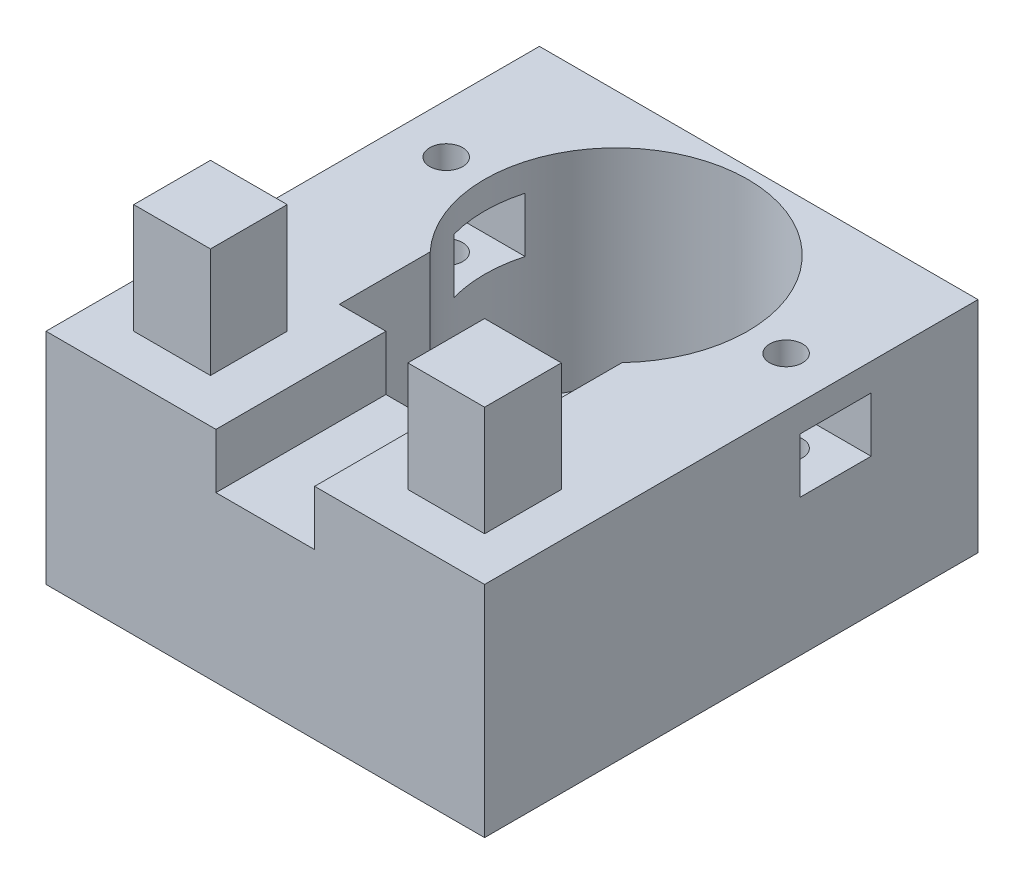
ISO-10303-21;
HEADER;
FILE_DESCRIPTION(('STEP AP214'),'2;1');
FILE_NAME('part.step','',(''),(''),'','','');
FILE_SCHEMA(('AUTOMOTIVE_DESIGN { 1 0 10303 214 1 1 1 1 }'));
ENDSEC;
DATA;
#1=APPLICATION_CONTEXT('core data for automotive mechanical design processes');
#2=APPLICATION_PROTOCOL_DEFINITION('international standard','automotive_design',2000,#1);
#3=PRODUCT_CONTEXT('',#1,'mechanical');
#4=PRODUCT('Part','Part','',(#3));
#5=PRODUCT_RELATED_PRODUCT_CATEGORY('part','',(#4));
#6=PRODUCT_DEFINITION_FORMATION('','',#4);
#7=PRODUCT_DEFINITION_CONTEXT('part definition',#1,'design');
#8=PRODUCT_DEFINITION('design','',#6,#7);
#9=PRODUCT_DEFINITION_SHAPE('','',#8);
#10=(LENGTH_UNIT() NAMED_UNIT(*) SI_UNIT(.MILLI.,.METRE.));
#11=(NAMED_UNIT(*) PLANE_ANGLE_UNIT() SI_UNIT($,.RADIAN.));
#12=(NAMED_UNIT(*) SI_UNIT($,.STERADIAN.) SOLID_ANGLE_UNIT());
#13=UNCERTAINTY_MEASURE_WITH_UNIT(LENGTH_MEASURE(1.E-05),#10,'distance_accuracy_value','');
#14=(GEOMETRIC_REPRESENTATION_CONTEXT(3) GLOBAL_UNCERTAINTY_ASSIGNED_CONTEXT((#13)) GLOBAL_UNIT_ASSIGNED_CONTEXT((#10,
#11,#12)) REPRESENTATION_CONTEXT('',''));
#15=CARTESIAN_POINT('',(0.,0.,0.));
#16=DIRECTION('',(0.,0.,1.));
#17=DIRECTION('',(1.,0.,0.));
#18=AXIS2_PLACEMENT_3D('',#15,#16,#17);
#19=CARTESIAN_POINT('',(0.,20.,0.));
#20=DIRECTION('',(0.,-1.,0.));
#21=DIRECTION('',(0.,0.,-1.));
#22=AXIS2_PLACEMENT_3D('',#19,#20,#21);
#23=PLANE('',#22);
#24=DIRECTION('',(0.,0.,-1.));
#25=VECTOR('',#24,1.);
#26=CARTESIAN_POINT('',(36.,20.,-11.));
#27=LINE('',#26,#25);
#28=CARTESIAN_POINT('',(36.,20.,-4.));
#29=VERTEX_POINT('',#28);
#30=CARTESIAN_POINT('',(36.,20.,-11.));
#31=VERTEX_POINT('',#30);
#32=EDGE_CURVE('E239',#29,#31,#27,.T.);
#33=ORIENTED_EDGE('',*,*,#32,.F.);
#34=DIRECTION('',(1.,0.,0.));
#35=VECTOR('',#34,1.);
#36=CARTESIAN_POINT('',(29.,20.,-4.));
#37=LINE('',#36,#35);
#38=CARTESIAN_POINT('',(29.,20.,-4.));
#39=VERTEX_POINT('',#38);
#40=EDGE_CURVE('E252',#39,#29,#37,.T.);
#41=ORIENTED_EDGE('',*,*,#40,.F.);
#42=DIRECTION('',(0.,0.,1.));
#43=VECTOR('',#42,1.);
#44=CARTESIAN_POINT('',(29.,20.,-11.));
#45=LINE('',#44,#43);
#46=CARTESIAN_POINT('',(29.,20.,-11.));
#47=VERTEX_POINT('',#46);
#48=EDGE_CURVE('E261',#47,#39,#45,.T.);
#49=ORIENTED_EDGE('',*,*,#48,.F.);
#50=DIRECTION('',(-1.,0.,0.));
#51=VECTOR('',#50,1.);
#52=CARTESIAN_POINT('',(29.,20.,-11.));
#53=LINE('',#52,#51);
#54=EDGE_CURVE('E242',#31,#47,#53,.T.);
#55=ORIENTED_EDGE('',*,*,#54,.F.);
#56=EDGE_LOOP('',(#33,#41,#49,#55));
#57=FACE_BOUND('',#56,.T.);
#58=CARTESIAN_POINT('',(35.5,20.,-32.));
#59=DIRECTION('',(0.,1.,0.));
#60=DIRECTION('',(0.,0.,1.));
#61=AXIS2_PLACEMENT_3D('',#58,#59,#60);
#62=CIRCLE('',#61,1.5);
#63=CARTESIAN_POINT('',(35.5,20.,-30.5));
#64=VERTEX_POINT('',#63);
#65=EDGE_CURVE('E353',#64,#64,#62,.T.);
#66=ORIENTED_EDGE('',*,*,#65,.F.);
#67=EDGE_LOOP('',(#66));
#68=FACE_BOUND('',#67,.T.);
#69=CARTESIAN_POINT('',(4.5,20.,-32.));
#70=DIRECTION('',(0.,1.,0.));
#71=DIRECTION('',(0.,0.,1.));
#72=AXIS2_PLACEMENT_3D('',#69,#70,#71);
#73=CIRCLE('',#72,1.5);
#74=CARTESIAN_POINT('',(4.5,20.,-30.5));
#75=VERTEX_POINT('',#74);
#76=EDGE_CURVE('E352',#75,#75,#73,.T.);
#77=ORIENTED_EDGE('',*,*,#76,.F.);
#78=EDGE_LOOP('',(#77));
#79=FACE_BOUND('',#78,.T.);
#80=DIRECTION('',(1.,0.,0.));
#81=VECTOR('',#80,1.);
#82=CARTESIAN_POINT('',(0.,20.,-15.5));
#83=LINE('',#82,#81);
#84=CARTESIAN_POINT('',(24.5,20.,-15.5));
#85=VERTEX_POINT('',#84);
#86=CARTESIAN_POINT('',(28.75,20.,-15.5));
#87=VERTEX_POINT('',#86);
#88=EDGE_CURVE('E382',#85,#87,#83,.T.);
#89=ORIENTED_EDGE('',*,*,#88,.F.);
#90=DIRECTION('',(0.,0.,-1.));
#91=VECTOR('',#90,1.);
#92=CARTESIAN_POINT('',(24.5,20.,3.26150985851279));
#93=LINE('',#92,#91);
#94=CARTESIAN_POINT('',(24.5,20.,0.));
#95=VERTEX_POINT('',#94);
#96=EDGE_CURVE('E277',#95,#85,#93,.T.);
#97=ORIENTED_EDGE('',*,*,#96,.F.);
#98=DIRECTION('',(1.,0.,0.));
#99=VECTOR('',#98,1.);
#100=CARTESIAN_POINT('',(0.,20.,0.));
#101=LINE('',#100,#99);
#102=CARTESIAN_POINT('',(40.,20.,0.));
#103=VERTEX_POINT('',#102);
#104=EDGE_CURVE('E398',#95,#103,#101,.T.);
#105=ORIENTED_EDGE('',*,*,#104,.T.);
#106=DIRECTION('',(0.,0.,-1.));
#107=VECTOR('',#106,1.);
#108=CARTESIAN_POINT('',(40.,20.,0.));
#109=LINE('',#108,#107);
#110=CARTESIAN_POINT('',(40.,20.,-45.));
#111=VERTEX_POINT('',#110);
#112=EDGE_CURVE('E403',#103,#111,#109,.T.);
#113=ORIENTED_EDGE('',*,*,#112,.T.);
#114=DIRECTION('',(-1.,0.,0.));
#115=VECTOR('',#114,1.);
#116=CARTESIAN_POINT('',(0.,20.,-45.));
#117=LINE('',#116,#115);
#118=CARTESIAN_POINT('',(0.,20.,-45.));
#119=VERTEX_POINT('',#118);
#120=EDGE_CURVE('E405',#111,#119,#117,.T.);
#121=ORIENTED_EDGE('',*,*,#120,.T.);
#122=DIRECTION('',(0.,0.,1.));
#123=VECTOR('',#122,1.);
#124=CARTESIAN_POINT('',(0.,20.,0.));
#125=LINE('',#124,#123);
#126=CARTESIAN_POINT('',(0.,20.,0.));
#127=VERTEX_POINT('',#126);
#128=EDGE_CURVE('E395',#119,#127,#125,.T.);
#129=ORIENTED_EDGE('',*,*,#128,.T.);
#130=CARTESIAN_POINT('',(15.5,20.,0.));
#131=VERTEX_POINT('',#130);
#132=EDGE_CURVE('E400',#127,#131,#101,.T.);
#133=ORIENTED_EDGE('',*,*,#132,.T.);
#134=DIRECTION('',(0.,0.,1.));
#135=VECTOR('',#134,1.);
#136=CARTESIAN_POINT('',(15.5,20.,3.26150985851279));
#137=LINE('',#136,#135);
#138=CARTESIAN_POINT('',(15.5,20.,-15.5));
#139=VERTEX_POINT('',#138);
#140=EDGE_CURVE('E281',#139,#131,#137,.T.);
#141=ORIENTED_EDGE('',*,*,#140,.F.);
#142=CARTESIAN_POINT('',(11.25,20.,-15.5));
#143=VERTEX_POINT('',#142);
#144=EDGE_CURVE('E366',#143,#139,#83,.T.);
#145=ORIENTED_EDGE('',*,*,#144,.F.);
#146=DIRECTION('',(0.,0.,-1.));
#147=VECTOR('',#146,1.);
#148=CARTESIAN_POINT('',(11.25,20.,0.));
#149=LINE('',#148,#147);
#150=CARTESIAN_POINT('',(11.25,20.,-23.7879661471716));
#151=VERTEX_POINT('',#150);
#152=EDGE_CURVE('E379',#143,#151,#149,.T.);
#153=ORIENTED_EDGE('',*,*,#152,.T.);
#154=CARTESIAN_POINT('',(20.,20.,-32.));
#155=DIRECTION('',(0.,1.,0.));
#156=DIRECTION('',(0.,0.,1.));
#157=AXIS2_PLACEMENT_3D('',#154,#155,#156);
#158=CIRCLE('',#157,12.);
#159=CARTESIAN_POINT('',(28.75,20.,-23.7879661471716));
#160=VERTEX_POINT('',#159);
#161=EDGE_CURVE('E376',#160,#151,#158,.T.);
#162=ORIENTED_EDGE('',*,*,#161,.F.);
#163=DIRECTION('',(0.,0.,-1.));
#164=VECTOR('',#163,1.);
#165=CARTESIAN_POINT('',(28.75,20.,0.));
#166=LINE('',#165,#164);
#167=EDGE_CURVE('E359',#87,#160,#166,.T.);
#168=ORIENTED_EDGE('',*,*,#167,.F.);
#169=EDGE_LOOP('',(#89,#97,#105,#113,#121,#129,#133,#141,#145,#153,#162,#168));
#170=FACE_BOUND('',#169,.T.);
#171=DIRECTION('',(0.,0.,-1.));
#172=VECTOR('',#171,1.);
#173=CARTESIAN_POINT('',(11.,20.,-4.));
#174=LINE('',#173,#172);
#175=CARTESIAN_POINT('',(11.,20.,-4.));
#176=VERTEX_POINT('',#175);
#177=CARTESIAN_POINT('',(11.,20.,-11.));
#178=VERTEX_POINT('',#177);
#179=EDGE_CURVE('E238',#176,#178,#174,.T.);
#180=ORIENTED_EDGE('',*,*,#179,.F.);
#181=DIRECTION('',(1.,0.,0.));
#182=VECTOR('',#181,1.);
#183=CARTESIAN_POINT('',(4.,20.,-4.));
#184=LINE('',#183,#182);
#185=CARTESIAN_POINT('',(4.,20.,-4.));
#186=VERTEX_POINT('',#185);
#187=EDGE_CURVE('E235',#186,#176,#184,.T.);
#188=ORIENTED_EDGE('',*,*,#187,.F.);
#189=DIRECTION('',(0.,0.,1.));
#190=VECTOR('',#189,1.);
#191=CARTESIAN_POINT('',(4.,20.,-4.));
#192=LINE('',#191,#190);
#193=CARTESIAN_POINT('',(4.,20.,-11.));
#194=VERTEX_POINT('',#193);
#195=EDGE_CURVE('E53',#194,#186,#192,.T.);
#196=ORIENTED_EDGE('',*,*,#195,.F.);
#197=DIRECTION('',(-1.,0.,0.));
#198=VECTOR('',#197,1.);
#199=CARTESIAN_POINT('',(4.,20.,-11.));
#200=LINE('',#199,#198);
#201=EDGE_CURVE('E48',#178,#194,#200,.T.);
#202=ORIENTED_EDGE('',*,*,#201,.F.);
#203=EDGE_LOOP('',(#180,#188,#196,#202));
#204=FACE_BOUND('',#203,.T.);
#205=ADVANCED_FACE('F33',(#57,#68,#79,#170,#204),#23,.F.);
#206=CARTESIAN_POINT('',(4.5,0.,-32.));
#207=DIRECTION('',(0.,1.,0.));
#208=DIRECTION('',(0.,0.,1.));
#209=AXIS2_PLACEMENT_3D('',#206,#207,#208);
#210=CYLINDRICAL_SURFACE('',#209,1.5);
#211=CARTESIAN_POINT('',(4.5,12.5,-32.));
#212=DIRECTION('',(0.,-1.,0.));
#213=DIRECTION('',(0.,0.,-1.));
#214=AXIS2_PLACEMENT_3D('',#211,#212,#213);
#215=CIRCLE('',#214,1.5);
#216=CARTESIAN_POINT('',(4.5,12.5,-33.5));
#217=VERTEX_POINT('',#216);
#218=EDGE_CURVE('E341',#217,#217,#215,.F.);
#219=ORIENTED_EDGE('',*,*,#218,.T.);
#220=EDGE_LOOP('',(#219));
#221=FACE_BOUND('',#220,.T.);
#222=CARTESIAN_POINT('',(4.5,0.,-32.));
#223=DIRECTION('',(0.,1.,0.));
#224=DIRECTION('',(0.,0.,1.));
#225=AXIS2_PLACEMENT_3D('',#222,#223,#224);
#226=CIRCLE('',#225,1.5);
#227=CARTESIAN_POINT('',(4.5,0.,-30.5));
#228=VERTEX_POINT('',#227);
#229=EDGE_CURVE('E356',#228,#228,#226,.T.);
#230=ORIENTED_EDGE('',*,*,#229,.F.);
#231=EDGE_LOOP('',(#230));
#232=FACE_BOUND('',#231,.T.);
#233=ADVANCED_FACE('F493',(#221,#232),#210,.F.);
#234=CARTESIAN_POINT('',(35.5,0.,-32.));
#235=DIRECTION('',(0.,1.,0.));
#236=DIRECTION('',(0.,0.,1.));
#237=AXIS2_PLACEMENT_3D('',#234,#235,#236);
#238=CYLINDRICAL_SURFACE('',#237,1.5);
#239=CARTESIAN_POINT('',(35.5,12.5,-32.));
#240=DIRECTION('',(0.,-1.,0.));
#241=DIRECTION('',(0.,0.,-1.));
#242=AXIS2_PLACEMENT_3D('',#239,#240,#241);
#243=CIRCLE('',#242,1.5);
#244=CARTESIAN_POINT('',(35.5,12.5,-33.5));
#245=VERTEX_POINT('',#244);
#246=EDGE_CURVE('E345',#245,#245,#243,.F.);
#247=ORIENTED_EDGE('',*,*,#246,.T.);
#248=EDGE_LOOP('',(#247));
#249=FACE_BOUND('',#248,.T.);
#250=CARTESIAN_POINT('',(35.5,0.,-32.));
#251=DIRECTION('',(0.,1.,0.));
#252=DIRECTION('',(0.,0.,1.));
#253=AXIS2_PLACEMENT_3D('',#250,#251,#252);
#254=CIRCLE('',#253,1.5);
#255=CARTESIAN_POINT('',(35.5,0.,-30.5));
#256=VERTEX_POINT('',#255);
#257=EDGE_CURVE('E349',#256,#256,#254,.T.);
#258=ORIENTED_EDGE('',*,*,#257,.F.);
#259=EDGE_LOOP('',(#258));
#260=FACE_BOUND('',#259,.T.);
#261=ADVANCED_FACE('F501',(#249,#260),#238,.F.);
#262=CARTESIAN_POINT('',(0.,20.,0.));
#263=DIRECTION('',(1.,0.,0.));
#264=DIRECTION('',(0.,0.,-1.));
#265=AXIS2_PLACEMENT_3D('',#262,#263,#264);
#266=PLANE('',#265);
#267=DIRECTION('',(0.,0.,-1.));
#268=VECTOR('',#267,1.);
#269=CARTESIAN_POINT('',(0.,12.5,-28.75));
#270=LINE('',#269,#268);
#271=CARTESIAN_POINT('',(0.,12.5,-28.75));
#272=VERTEX_POINT('',#271);
#273=CARTESIAN_POINT('',(0.,12.5,-35.25));
#274=VERTEX_POINT('',#273);
#275=EDGE_CURVE('E306',#272,#274,#270,.T.);
#276=ORIENTED_EDGE('',*,*,#275,.T.);
#277=DIRECTION('',(0.,1.,0.));
#278=VECTOR('',#277,1.);
#279=CARTESIAN_POINT('',(0.,17.5,-35.25));
#280=LINE('',#279,#278);
#281=CARTESIAN_POINT('',(0.,17.5,-35.25));
#282=VERTEX_POINT('',#281);
#283=EDGE_CURVE('E296',#274,#282,#280,.T.);
#284=ORIENTED_EDGE('',*,*,#283,.T.);
#285=DIRECTION('',(0.,0.,1.));
#286=VECTOR('',#285,1.);
#287=CARTESIAN_POINT('',(0.,17.5,-28.75));
#288=LINE('',#287,#286);
#289=CARTESIAN_POINT('',(0.,17.5,-28.75));
#290=VERTEX_POINT('',#289);
#291=EDGE_CURVE('E299',#282,#290,#288,.T.);
#292=ORIENTED_EDGE('',*,*,#291,.T.);
#293=DIRECTION('',(0.,-1.,0.));
#294=VECTOR('',#293,1.);
#295=CARTESIAN_POINT('',(0.,17.5,-28.75));
#296=LINE('',#295,#294);
#297=EDGE_CURVE('E303',#290,#272,#296,.T.);
#298=ORIENTED_EDGE('',*,*,#297,.T.);
#299=EDGE_LOOP('',(#276,#284,#292,#298));
#300=FACE_BOUND('',#299,.T.);
#301=DIRECTION('',(0.,0.,1.));
#302=VECTOR('',#301,1.);
#303=CARTESIAN_POINT('',(0.,0.,0.));
#304=LINE('',#303,#302);
#305=CARTESIAN_POINT('',(0.,0.,-45.));
#306=VERTEX_POINT('',#305);
#307=CARTESIAN_POINT('',(0.,0.,0.));
#308=VERTEX_POINT('',#307);
#309=EDGE_CURVE('E388',#306,#308,#304,.T.);
#310=ORIENTED_EDGE('',*,*,#309,.T.);
#311=DIRECTION('',(0.,-1.,0.));
#312=VECTOR('',#311,1.);
#313=CARTESIAN_POINT('',(0.,20.,0.));
#314=LINE('',#313,#312);
#315=EDGE_CURVE('E423',#127,#308,#314,.T.);
#316=ORIENTED_EDGE('',*,*,#315,.F.);
#317=ORIENTED_EDGE('',*,*,#128,.F.);
#318=DIRECTION('',(0.,-1.,0.));
#319=VECTOR('',#318,1.);
#320=CARTESIAN_POINT('',(0.,20.,-45.));
#321=LINE('',#320,#319);
#322=EDGE_CURVE('E407',#119,#306,#321,.T.);
#323=ORIENTED_EDGE('',*,*,#322,.T.);
#324=EDGE_LOOP('',(#310,#316,#317,#323));
#325=FACE_BOUND('',#324,.T.);
#326=ADVANCED_FACE('F35',(#300,#325),#266,.F.);
#327=CARTESIAN_POINT('',(0.,20.,0.));
#328=DIRECTION('',(0.,0.,-1.));
#329=DIRECTION('',(-1.,0.,0.));
#330=AXIS2_PLACEMENT_3D('',#327,#328,#329);
#331=PLANE('',#330);
#332=ORIENTED_EDGE('',*,*,#104,.F.);
#333=DIRECTION('',(0.,-1.,0.));
#334=VECTOR('',#333,1.);
#335=CARTESIAN_POINT('',(24.5,20.,0.));
#336=LINE('',#335,#334);
#337=CARTESIAN_POINT('',(24.5,15.,0.));
#338=VERTEX_POINT('',#337);
#339=EDGE_CURVE('E292',#95,#338,#336,.T.);
#340=ORIENTED_EDGE('',*,*,#339,.T.);
#341=DIRECTION('',(-1.,0.,0.));
#342=VECTOR('',#341,1.);
#343=CARTESIAN_POINT('',(0.,15.,0.));
#344=LINE('',#343,#342);
#345=CARTESIAN_POINT('',(15.5,15.,0.));
#346=VERTEX_POINT('',#345);
#347=EDGE_CURVE('E284',#338,#346,#344,.T.);
#348=ORIENTED_EDGE('',*,*,#347,.T.);
#349=DIRECTION('',(0.,1.,0.));
#350=VECTOR('',#349,1.);
#351=CARTESIAN_POINT('',(15.5,20.,0.));
#352=LINE('',#351,#350);
#353=EDGE_CURVE('E289',#346,#131,#352,.T.);
#354=ORIENTED_EDGE('',*,*,#353,.T.);
#355=ORIENTED_EDGE('',*,*,#132,.F.);
#356=ORIENTED_EDGE('',*,*,#315,.T.);
#357=DIRECTION('',(1.,0.,0.));
#358=VECTOR('',#357,1.);
#359=CARTESIAN_POINT('',(0.,0.,0.));
#360=LINE('',#359,#358);
#361=CARTESIAN_POINT('',(40.,0.,0.));
#362=VERTEX_POINT('',#361);
#363=EDGE_CURVE('E410',#308,#362,#360,.T.);
#364=ORIENTED_EDGE('',*,*,#363,.T.);
#365=DIRECTION('',(0.,-1.,0.));
#366=VECTOR('',#365,1.);
#367=CARTESIAN_POINT('',(40.,20.,0.));
#368=LINE('',#367,#366);
#369=EDGE_CURVE('E420',#103,#362,#368,.T.);
#370=ORIENTED_EDGE('',*,*,#369,.F.);
#371=EDGE_LOOP('',(#332,#340,#348,#354,#355,#356,#364,#370));
#372=FACE_BOUND('',#371,.T.);
#373=ADVANCED_FACE('F458',(#372),#331,.F.);
#374=CARTESIAN_POINT('',(40.,20.,0.));
#375=DIRECTION('',(-1.,0.,0.));
#376=DIRECTION('',(0.,0.,1.));
#377=AXIS2_PLACEMENT_3D('',#374,#375,#376);
#378=PLANE('',#377);
#379=DIRECTION('',(0.,0.,1.));
#380=VECTOR('',#379,1.);
#381=CARTESIAN_POINT('',(40.,17.5,-28.75));
#382=LINE('',#381,#380);
#383=CARTESIAN_POINT('',(40.,17.5,-35.25));
#384=VERTEX_POINT('',#383);
#385=CARTESIAN_POINT('',(40.,17.5,-28.75));
#386=VERTEX_POINT('',#385);
#387=EDGE_CURVE('E311',#384,#386,#382,.T.);
#388=ORIENTED_EDGE('',*,*,#387,.F.);
#389=DIRECTION('',(0.,1.,0.));
#390=VECTOR('',#389,1.);
#391=CARTESIAN_POINT('',(40.,17.5,-35.25));
#392=LINE('',#391,#390);
#393=CARTESIAN_POINT('',(40.,12.5,-35.25));
#394=VERTEX_POINT('',#393);
#395=EDGE_CURVE('E295',#394,#384,#392,.T.);
#396=ORIENTED_EDGE('',*,*,#395,.F.);
#397=DIRECTION('',(0.,0.,-1.));
#398=VECTOR('',#397,1.);
#399=CARTESIAN_POINT('',(40.,12.5,-28.75));
#400=LINE('',#399,#398);
#401=CARTESIAN_POINT('',(40.,12.5,-28.75));
#402=VERTEX_POINT('',#401);
#403=EDGE_CURVE('E300',#402,#394,#400,.T.);
#404=ORIENTED_EDGE('',*,*,#403,.F.);
#405=DIRECTION('',(0.,-1.,0.));
#406=VECTOR('',#405,1.);
#407=CARTESIAN_POINT('',(40.,17.5,-28.75));
#408=LINE('',#407,#406);
#409=EDGE_CURVE('E314',#386,#402,#408,.T.);
#410=ORIENTED_EDGE('',*,*,#409,.F.);
#411=EDGE_LOOP('',(#388,#396,#404,#410));
#412=FACE_BOUND('',#411,.T.);
#413=DIRECTION('',(0.,0.,-1.));
#414=VECTOR('',#413,1.);
#415=CARTESIAN_POINT('',(40.,0.,0.));
#416=LINE('',#415,#414);
#417=CARTESIAN_POINT('',(40.,0.,-45.));
#418=VERTEX_POINT('',#417);
#419=EDGE_CURVE('E412',#362,#418,#416,.T.);
#420=ORIENTED_EDGE('',*,*,#419,.T.);
#421=DIRECTION('',(0.,-1.,0.));
#422=VECTOR('',#421,1.);
#423=CARTESIAN_POINT('',(40.,20.,-45.));
#424=LINE('',#423,#422);
#425=EDGE_CURVE('E417',#111,#418,#424,.T.);
#426=ORIENTED_EDGE('',*,*,#425,.F.);
#427=ORIENTED_EDGE('',*,*,#112,.F.);
#428=ORIENTED_EDGE('',*,*,#369,.T.);
#429=EDGE_LOOP('',(#420,#426,#427,#428));
#430=FACE_BOUND('',#429,.T.);
#431=ADVANCED_FACE('F515',(#412,#430),#378,.F.);
#432=CARTESIAN_POINT('',(0.,20.,-45.));
#433=DIRECTION('',(0.,0.,1.));
#434=DIRECTION('',(1.,0.,0.));
#435=AXIS2_PLACEMENT_3D('',#432,#433,#434);
#436=PLANE('',#435);
#437=DIRECTION('',(-1.,0.,0.));
#438=VECTOR('',#437,1.);
#439=CARTESIAN_POINT('',(0.,0.,-45.));
#440=LINE('',#439,#438);
#441=EDGE_CURVE('E399',#418,#306,#440,.T.);
#442=ORIENTED_EDGE('',*,*,#441,.T.);
#443=ORIENTED_EDGE('',*,*,#322,.F.);
#444=ORIENTED_EDGE('',*,*,#120,.F.);
#445=ORIENTED_EDGE('',*,*,#425,.T.);
#446=EDGE_LOOP('',(#442,#443,#444,#445));
#447=FACE_BOUND('',#446,.T.);
#448=ADVANCED_FACE('F511',(#447),#436,.F.);
#449=CARTESIAN_POINT('',(0.,0.,0.));
#450=DIRECTION('',(0.,-1.,0.));
#451=DIRECTION('',(0.,0.,-1.));
#452=AXIS2_PLACEMENT_3D('',#449,#450,#451);
#453=PLANE('',#452);
#454=ORIENTED_EDGE('',*,*,#257,.T.);
#455=EDGE_LOOP('',(#454));
#456=FACE_BOUND('',#455,.T.);
#457=ORIENTED_EDGE('',*,*,#229,.T.);
#458=EDGE_LOOP('',(#457));
#459=FACE_BOUND('',#458,.T.);
#460=ORIENTED_EDGE('',*,*,#309,.F.);
#461=ORIENTED_EDGE('',*,*,#441,.F.);
#462=ORIENTED_EDGE('',*,*,#419,.F.);
#463=ORIENTED_EDGE('',*,*,#363,.F.);
#464=EDGE_LOOP('',(#460,#461,#462,#463));
#465=FACE_BOUND('',#464,.T.);
#466=ADVANCED_FACE('F508',(#456,#459,#465),#453,.T.);
#467=CARTESIAN_POINT('',(28.75,1.,0.));
#468=DIRECTION('',(1.,0.,0.));
#469=DIRECTION('',(0.,0.,-1.));
#470=AXIS2_PLACEMENT_3D('',#467,#468,#469);
#471=PLANE('',#470);
#472=ORIENTED_EDGE('',*,*,#167,.T.);
#473=DIRECTION('',(0.,1.,0.));
#474=VECTOR('',#473,1.);
#475=CARTESIAN_POINT('',(28.75,1.,-23.7879661471716));
#476=LINE('',#475,#474);
#477=CARTESIAN_POINT('',(28.75,1.,-23.7879661471716));
#478=VERTEX_POINT('',#477);
#479=EDGE_CURVE('E374',#478,#160,#476,.T.);
#480=ORIENTED_EDGE('',*,*,#479,.F.);
#481=DIRECTION('',(0.,0.,-1.));
#482=VECTOR('',#481,1.);
#483=CARTESIAN_POINT('',(28.75,1.,0.));
#484=LINE('',#483,#482);
#485=CARTESIAN_POINT('',(28.75,1.,-15.5));
#486=VERTEX_POINT('',#485);
#487=EDGE_CURVE('E362',#486,#478,#484,.T.);
#488=ORIENTED_EDGE('',*,*,#487,.F.);
#489=DIRECTION('',(0.,1.,0.));
#490=VECTOR('',#489,1.);
#491=CARTESIAN_POINT('',(28.75,1.,-15.5));
#492=LINE('',#491,#490);
#493=EDGE_CURVE('E385',#486,#87,#492,.T.);
#494=ORIENTED_EDGE('',*,*,#493,.T.);
#495=EDGE_LOOP('',(#472,#480,#488,#494));
#496=FACE_BOUND('',#495,.T.);
#497=ADVANCED_FACE('F469',(#496),#471,.F.);
#498=CARTESIAN_POINT('',(0.,1.,-15.5));
#499=DIRECTION('',(0.,0.,1.));
#500=DIRECTION('',(1.,0.,0.));
#501=AXIS2_PLACEMENT_3D('',#498,#499,#500);
#502=PLANE('',#501);
#503=DIRECTION('',(1.,0.,0.));
#504=VECTOR('',#503,1.);
#505=CARTESIAN_POINT('',(0.,15.,-15.5));
#506=LINE('',#505,#504);
#507=CARTESIAN_POINT('',(15.5,15.,-15.5));
#508=VERTEX_POINT('',#507);
#509=CARTESIAN_POINT('',(24.5,15.,-15.5));
#510=VERTEX_POINT('',#509);
#511=EDGE_CURVE('E442',#508,#510,#506,.T.);
#512=ORIENTED_EDGE('',*,*,#511,.T.);
#513=DIRECTION('',(0.,1.,0.));
#514=VECTOR('',#513,1.);
#515=CARTESIAN_POINT('',(24.5,1.,-15.5));
#516=LINE('',#515,#514);
#517=EDGE_CURVE('E11',#510,#85,#516,.T.);
#518=ORIENTED_EDGE('',*,*,#517,.T.);
#519=ORIENTED_EDGE('',*,*,#88,.T.);
#520=ORIENTED_EDGE('',*,*,#493,.F.);
#521=DIRECTION('',(1.,0.,0.));
#522=VECTOR('',#521,1.);
#523=CARTESIAN_POINT('',(0.,1.,-15.5));
#524=LINE('',#523,#522);
#525=CARTESIAN_POINT('',(11.25,1.,-15.5));
#526=VERTEX_POINT('',#525);
#527=EDGE_CURVE('E371',#526,#486,#524,.T.);
#528=ORIENTED_EDGE('',*,*,#527,.F.);
#529=DIRECTION('',(0.,1.,0.));
#530=VECTOR('',#529,1.);
#531=CARTESIAN_POINT('',(11.25,1.,-15.5));
#532=LINE('',#531,#530);
#533=EDGE_CURVE('E389',#526,#143,#532,.T.);
#534=ORIENTED_EDGE('',*,*,#533,.T.);
#535=ORIENTED_EDGE('',*,*,#144,.T.);
#536=DIRECTION('',(0.,-1.,0.));
#537=VECTOR('',#536,1.);
#538=CARTESIAN_POINT('',(15.5,1.,-15.5));
#539=LINE('',#538,#537);
#540=EDGE_CURVE('E41',#139,#508,#539,.T.);
#541=ORIENTED_EDGE('',*,*,#540,.T.);
#542=EDGE_LOOP('',(#512,#518,#519,#520,#528,#534,#535,#541));
#543=FACE_BOUND('',#542,.T.);
#544=ADVANCED_FACE('F446',(#543),#502,.F.);
#545=CARTESIAN_POINT('',(11.25,1.,0.));
#546=DIRECTION('',(1.,0.,0.));
#547=DIRECTION('',(0.,0.,-1.));
#548=AXIS2_PLACEMENT_3D('',#545,#546,#547);
#549=PLANE('',#548);
#550=ORIENTED_EDGE('',*,*,#152,.F.);
#551=ORIENTED_EDGE('',*,*,#533,.F.);
#552=DIRECTION('',(0.,0.,-1.));
#553=VECTOR('',#552,1.);
#554=CARTESIAN_POINT('',(11.25,1.,0.));
#555=LINE('',#554,#553);
#556=CARTESIAN_POINT('',(11.25,1.,-23.7879661471716));
#557=VERTEX_POINT('',#556);
#558=EDGE_CURVE('E369',#526,#557,#555,.T.);
#559=ORIENTED_EDGE('',*,*,#558,.T.);
#560=DIRECTION('',(0.,1.,0.));
#561=VECTOR('',#560,1.);
#562=CARTESIAN_POINT('',(11.25,1.,-23.7879661471716));
#563=LINE('',#562,#561);
#564=EDGE_CURVE('E391',#557,#151,#563,.T.);
#565=ORIENTED_EDGE('',*,*,#564,.T.);
#566=EDGE_LOOP('',(#550,#551,#559,#565));
#567=FACE_BOUND('',#566,.T.);
#568=ADVANCED_FACE('F481',(#567),#549,.T.);
#569=CARTESIAN_POINT('',(20.,1.,-32.));
#570=DIRECTION('',(0.,1.,0.));
#571=DIRECTION('',(0.,0.,1.));
#572=AXIS2_PLACEMENT_3D('',#569,#570,#571);
#573=CYLINDRICAL_SURFACE('',#572,12.);
#574=CARTESIAN_POINT('',(20.,17.5,-32.));
#575=DIRECTION('',(0.,1.,0.));
#576=DIRECTION('',(0.,0.,1.));
#577=AXIS2_PLACEMENT_3D('',#574,#575,#576);
#578=CIRCLE('',#577,12.);
#579=CARTESIAN_POINT('',(8.44848494785207,17.5,-28.75));
#580=VERTEX_POINT('',#579);
#581=CARTESIAN_POINT('',(8.44848494785208,17.5,-35.25));
#582=VERTEX_POINT('',#581);
#583=EDGE_CURVE('E340',#580,#582,#578,.F.);
#584=ORIENTED_EDGE('',*,*,#583,.T.);
#585=DIRECTION('',(0.,1.,0.));
#586=VECTOR('',#585,1.);
#587=CARTESIAN_POINT('',(8.44848494785208,1.,-35.25));
#588=LINE('',#587,#586);
#589=CARTESIAN_POINT('',(8.44848494785208,12.5,-35.25));
#590=VERTEX_POINT('',#589);
#591=EDGE_CURVE('E439',#582,#590,#588,.F.);
#592=ORIENTED_EDGE('',*,*,#591,.T.);
#593=CARTESIAN_POINT('',(20.,12.5,-32.));
#594=DIRECTION('',(0.,-1.,0.));
#595=DIRECTION('',(0.,0.,-1.));
#596=AXIS2_PLACEMENT_3D('',#593,#594,#595);
#597=CIRCLE('',#596,12.);
#598=CARTESIAN_POINT('',(8.44848494785207,12.5,-28.75));
#599=VERTEX_POINT('',#598);
#600=EDGE_CURVE('E348',#590,#599,#597,.F.);
#601=ORIENTED_EDGE('',*,*,#600,.T.);
#602=DIRECTION('',(0.,1.,0.));
#603=VECTOR('',#602,1.);
#604=CARTESIAN_POINT('',(8.44848494785207,1.,-28.75));
#605=LINE('',#604,#603);
#606=EDGE_CURVE('E436',#599,#580,#605,.T.);
#607=ORIENTED_EDGE('',*,*,#606,.T.);
#608=EDGE_LOOP('',(#584,#592,#601,#607));
#609=FACE_BOUND('',#608,.T.);
#610=CARTESIAN_POINT('',(31.5515150521479,12.5,-28.75));
#611=VERTEX_POINT('',#610);
#612=CARTESIAN_POINT('',(31.5515150521479,12.5,-35.25));
#613=VERTEX_POINT('',#612);
#614=EDGE_CURVE('E344',#611,#613,#597,.F.);
#615=ORIENTED_EDGE('',*,*,#614,.T.);
#616=DIRECTION('',(0.,1.,0.));
#617=VECTOR('',#616,1.);
#618=CARTESIAN_POINT('',(31.5515150521479,1.,-35.25));
#619=LINE('',#618,#617);
#620=CARTESIAN_POINT('',(31.5515150521479,17.5,-35.25));
#621=VERTEX_POINT('',#620);
#622=EDGE_CURVE('E433',#613,#621,#619,.T.);
#623=ORIENTED_EDGE('',*,*,#622,.T.);
#624=CARTESIAN_POINT('',(31.5515150521479,17.5,-28.75));
#625=VERTEX_POINT('',#624);
#626=EDGE_CURVE('E337',#621,#625,#578,.F.);
#627=ORIENTED_EDGE('',*,*,#626,.T.);
#628=DIRECTION('',(0.,1.,0.));
#629=VECTOR('',#628,1.);
#630=CARTESIAN_POINT('',(31.5515150521479,1.,-28.75));
#631=LINE('',#630,#629);
#632=EDGE_CURVE('E426',#625,#611,#631,.F.);
#633=ORIENTED_EDGE('',*,*,#632,.T.);
#634=EDGE_LOOP('',(#615,#623,#627,#633));
#635=FACE_BOUND('',#634,.T.);
#636=ORIENTED_EDGE('',*,*,#161,.T.);
#637=ORIENTED_EDGE('',*,*,#564,.F.);
#638=CARTESIAN_POINT('',(20.,1.,-32.));
#639=DIRECTION('',(0.,1.,0.));
#640=DIRECTION('',(0.,0.,1.));
#641=AXIS2_PLACEMENT_3D('',#638,#639,#640);
#642=CIRCLE('',#641,12.);
#643=EDGE_CURVE('E365',#478,#557,#642,.T.);
#644=ORIENTED_EDGE('',*,*,#643,.F.);
#645=ORIENTED_EDGE('',*,*,#479,.T.);
#646=EDGE_LOOP('',(#636,#637,#644,#645));
#647=FACE_BOUND('',#646,.T.);
#648=ADVANCED_FACE('F473',(#609,#635,#647),#573,.F.);
#649=CARTESIAN_POINT('',(0.,1.,0.));
#650=DIRECTION('',(0.,1.,0.));
#651=DIRECTION('',(0.,0.,1.));
#652=AXIS2_PLACEMENT_3D('',#649,#650,#651);
#653=PLANE('',#652);
#654=ORIENTED_EDGE('',*,*,#487,.T.);
#655=ORIENTED_EDGE('',*,*,#643,.T.);
#656=ORIENTED_EDGE('',*,*,#558,.F.);
#657=ORIENTED_EDGE('',*,*,#527,.T.);
#658=EDGE_LOOP('',(#654,#655,#656,#657));
#659=FACE_BOUND('',#658,.T.);
#660=ADVANCED_FACE('F477',(#659),#653,.T.);
#661=CARTESIAN_POINT('',(4.5,17.5,-32.));
#662=DIRECTION('',(0.,1.,0.));
#663=DIRECTION('',(0.,0.,1.));
#664=AXIS2_PLACEMENT_3D('',#661,#662,#663);
#665=CIRCLE('',#664,1.5);
#666=CARTESIAN_POINT('',(4.5,17.5,-30.5));
#667=VERTEX_POINT('',#666);
#668=EDGE_CURVE('E334',#667,#667,#665,.F.);
#669=ORIENTED_EDGE('',*,*,#668,.T.);
#670=EDGE_LOOP('',(#669));
#671=FACE_BOUND('',#670,.T.);
#672=ORIENTED_EDGE('',*,*,#76,.T.);
#673=EDGE_LOOP('',(#672));
#674=FACE_BOUND('',#673,.T.);
#675=ADVANCED_FACE('F504',(#671,#674),#210,.F.);
#676=CARTESIAN_POINT('',(35.5,17.5,-32.));
#677=DIRECTION('',(0.,1.,0.));
#678=DIRECTION('',(0.,0.,1.));
#679=AXIS2_PLACEMENT_3D('',#676,#677,#678);
#680=CIRCLE('',#679,1.5);
#681=CARTESIAN_POINT('',(35.5,17.5,-30.5));
#682=VERTEX_POINT('',#681);
#683=EDGE_CURVE('E322',#682,#682,#680,.F.);
#684=ORIENTED_EDGE('',*,*,#683,.T.);
#685=EDGE_LOOP('',(#684));
#686=FACE_BOUND('',#685,.T.);
#687=ORIENTED_EDGE('',*,*,#65,.T.);
#688=EDGE_LOOP('',(#687));
#689=FACE_BOUND('',#688,.T.);
#690=ADVANCED_FACE('F530',(#686,#689),#238,.F.);
#691=CARTESIAN_POINT('',(0.,12.5,-28.75));
#692=DIRECTION('',(0.,-1.,0.));
#693=DIRECTION('',(0.,0.,-1.));
#694=AXIS2_PLACEMENT_3D('',#691,#692,#693);
#695=PLANE('',#694);
#696=ORIENTED_EDGE('',*,*,#246,.F.);
#697=EDGE_LOOP('',(#696));
#698=FACE_BOUND('',#697,.T.);
#699=DIRECTION('',(1.,0.,0.));
#700=VECTOR('',#699,1.);
#701=CARTESIAN_POINT('',(0.,12.5,-28.75));
#702=LINE('',#701,#700);
#703=EDGE_CURVE('E327',#611,#402,#702,.T.);
#704=ORIENTED_EDGE('',*,*,#703,.T.);
#705=ORIENTED_EDGE('',*,*,#403,.T.);
#706=DIRECTION('',(1.,0.,0.));
#707=VECTOR('',#706,1.);
#708=CARTESIAN_POINT('',(0.,12.5,-35.25));
#709=LINE('',#708,#707);
#710=EDGE_CURVE('E323',#613,#394,#709,.T.);
#711=ORIENTED_EDGE('',*,*,#710,.F.);
#712=ORIENTED_EDGE('',*,*,#614,.F.);
#713=EDGE_LOOP('',(#704,#705,#711,#712));
#714=FACE_BOUND('',#713,.T.);
#715=ADVANCED_FACE('F562',(#698,#714),#695,.F.);
#716=CARTESIAN_POINT('',(0.,17.5,-28.75));
#717=DIRECTION('',(0.,1.,0.));
#718=DIRECTION('',(0.,0.,1.));
#719=AXIS2_PLACEMENT_3D('',#716,#717,#718);
#720=PLANE('',#719);
#721=ORIENTED_EDGE('',*,*,#683,.F.);
#722=EDGE_LOOP('',(#721));
#723=FACE_BOUND('',#722,.T.);
#724=DIRECTION('',(1.,0.,0.));
#725=VECTOR('',#724,1.);
#726=CARTESIAN_POINT('',(0.,17.5,-35.25));
#727=LINE('',#726,#725);
#728=EDGE_CURVE('E309',#621,#384,#727,.T.);
#729=ORIENTED_EDGE('',*,*,#728,.T.);
#730=ORIENTED_EDGE('',*,*,#387,.T.);
#731=DIRECTION('',(1.,0.,0.));
#732=VECTOR('',#731,1.);
#733=CARTESIAN_POINT('',(0.,17.5,-28.75));
#734=LINE('',#733,#732);
#735=EDGE_CURVE('E331',#625,#386,#734,.T.);
#736=ORIENTED_EDGE('',*,*,#735,.F.);
#737=ORIENTED_EDGE('',*,*,#626,.F.);
#738=EDGE_LOOP('',(#729,#730,#736,#737));
#739=FACE_BOUND('',#738,.T.);
#740=ADVANCED_FACE('F574',(#723,#739),#720,.F.);
#741=CARTESIAN_POINT('',(0.,17.5,-28.75));
#742=DIRECTION('',(0.,0.,1.));
#743=DIRECTION('',(1.,0.,0.));
#744=AXIS2_PLACEMENT_3D('',#741,#742,#743);
#745=PLANE('',#744);
#746=ORIENTED_EDGE('',*,*,#735,.T.);
#747=ORIENTED_EDGE('',*,*,#409,.T.);
#748=ORIENTED_EDGE('',*,*,#703,.F.);
#749=ORIENTED_EDGE('',*,*,#632,.F.);
#750=EDGE_LOOP('',(#746,#747,#748,#749));
#751=FACE_BOUND('',#750,.T.);
#752=ADVANCED_FACE('F564',(#751),#745,.F.);
#753=CARTESIAN_POINT('',(0.,17.5,-35.25));
#754=DIRECTION('',(0.,0.,-1.));
#755=DIRECTION('',(-1.,0.,0.));
#756=AXIS2_PLACEMENT_3D('',#753,#754,#755);
#757=PLANE('',#756);
#758=ORIENTED_EDGE('',*,*,#710,.T.);
#759=ORIENTED_EDGE('',*,*,#395,.T.);
#760=ORIENTED_EDGE('',*,*,#728,.F.);
#761=ORIENTED_EDGE('',*,*,#622,.F.);
#762=EDGE_LOOP('',(#758,#759,#760,#761));
#763=FACE_BOUND('',#762,.T.);
#764=ADVANCED_FACE('F572',(#763),#757,.F.);
#765=EDGE_CURVE('E332',#282,#582,#727,.T.);
#766=ORIENTED_EDGE('',*,*,#765,.F.);
#767=ORIENTED_EDGE('',*,*,#283,.F.);
#768=EDGE_CURVE('E319',#274,#590,#709,.T.);
#769=ORIENTED_EDGE('',*,*,#768,.T.);
#770=ORIENTED_EDGE('',*,*,#591,.F.);
#771=EDGE_LOOP('',(#766,#767,#769,#770));
#772=FACE_BOUND('',#771,.T.);
#773=ADVANCED_FACE('F549',(#772),#757,.F.);
#774=EDGE_CURVE('E324',#272,#599,#702,.T.);
#775=ORIENTED_EDGE('',*,*,#774,.F.);
#776=ORIENTED_EDGE('',*,*,#297,.F.);
#777=EDGE_CURVE('E328',#290,#580,#734,.T.);
#778=ORIENTED_EDGE('',*,*,#777,.T.);
#779=ORIENTED_EDGE('',*,*,#606,.F.);
#780=EDGE_LOOP('',(#775,#776,#778,#779));
#781=FACE_BOUND('',#780,.T.);
#782=ADVANCED_FACE('F556',(#781),#745,.F.);
#783=ORIENTED_EDGE('',*,*,#218,.F.);
#784=EDGE_LOOP('',(#783));
#785=FACE_BOUND('',#784,.T.);
#786=ORIENTED_EDGE('',*,*,#768,.F.);
#787=ORIENTED_EDGE('',*,*,#275,.F.);
#788=ORIENTED_EDGE('',*,*,#774,.T.);
#789=ORIENTED_EDGE('',*,*,#600,.F.);
#790=EDGE_LOOP('',(#786,#787,#788,#789));
#791=FACE_BOUND('',#790,.T.);
#792=ADVANCED_FACE('F545',(#785,#791),#695,.F.);
#793=ORIENTED_EDGE('',*,*,#668,.F.);
#794=EDGE_LOOP('',(#793));
#795=FACE_BOUND('',#794,.T.);
#796=ORIENTED_EDGE('',*,*,#777,.F.);
#797=ORIENTED_EDGE('',*,*,#291,.F.);
#798=ORIENTED_EDGE('',*,*,#765,.T.);
#799=ORIENTED_EDGE('',*,*,#583,.F.);
#800=EDGE_LOOP('',(#796,#797,#798,#799));
#801=FACE_BOUND('',#800,.T.);
#802=ADVANCED_FACE('F554',(#795,#801),#720,.F.);
#803=CARTESIAN_POINT('',(24.5,15.,3.26150985851279));
#804=DIRECTION('',(1.,0.,0.));
#805=DIRECTION('',(0.,0.,-1.));
#806=AXIS2_PLACEMENT_3D('',#803,#804,#805);
#807=PLANE('',#806);
#808=ORIENTED_EDGE('',*,*,#96,.T.);
#809=ORIENTED_EDGE('',*,*,#517,.F.);
#810=DIRECTION('',(0.,0.,-1.));
#811=VECTOR('',#810,1.);
#812=CARTESIAN_POINT('',(24.5,15.,3.26150985851279));
#813=LINE('',#812,#811);
#814=EDGE_CURVE('E278',#338,#510,#813,.T.);
#815=ORIENTED_EDGE('',*,*,#814,.F.);
#816=ORIENTED_EDGE('',*,*,#339,.F.);
#817=EDGE_LOOP('',(#808,#809,#815,#816));
#818=FACE_BOUND('',#817,.T.);
#819=ADVANCED_FACE('F464',(#818),#807,.F.);
#820=CARTESIAN_POINT('',(15.5,15.,3.26150985851279));
#821=DIRECTION('',(-1.,0.,0.));
#822=DIRECTION('',(0.,0.,1.));
#823=AXIS2_PLACEMENT_3D('',#820,#821,#822);
#824=PLANE('',#823);
#825=DIRECTION('',(0.,0.,1.));
#826=VECTOR('',#825,1.);
#827=CARTESIAN_POINT('',(15.5,15.,3.26150985851279));
#828=LINE('',#827,#826);
#829=EDGE_CURVE('E280',#508,#346,#828,.T.);
#830=ORIENTED_EDGE('',*,*,#829,.F.);
#831=ORIENTED_EDGE('',*,*,#540,.F.);
#832=ORIENTED_EDGE('',*,*,#140,.T.);
#833=ORIENTED_EDGE('',*,*,#353,.F.);
#834=EDGE_LOOP('',(#830,#831,#832,#833));
#835=FACE_BOUND('',#834,.T.);
#836=ADVANCED_FACE('F451',(#835),#824,.F.);
#837=CARTESIAN_POINT('',(0.,15.,0.));
#838=DIRECTION('',(0.,-1.,0.));
#839=DIRECTION('',(0.,0.,-1.));
#840=AXIS2_PLACEMENT_3D('',#837,#838,#839);
#841=PLANE('',#840);
#842=ORIENTED_EDGE('',*,*,#814,.T.);
#843=ORIENTED_EDGE('',*,*,#511,.F.);
#844=ORIENTED_EDGE('',*,*,#829,.T.);
#845=ORIENTED_EDGE('',*,*,#347,.F.);
#846=EDGE_LOOP('',(#842,#843,#844,#845));
#847=FACE_BOUND('',#846,.T.);
#848=ADVANCED_FACE('F460',(#847),#841,.F.);
#849=CARTESIAN_POINT('',(36.,30.,-11.));
#850=DIRECTION('',(-1.,0.,0.));
#851=DIRECTION('',(0.,0.,1.));
#852=AXIS2_PLACEMENT_3D('',#849,#850,#851);
#853=PLANE('',#852);
#854=ORIENTED_EDGE('',*,*,#32,.T.);
#855=DIRECTION('',(0.,-1.,0.));
#856=VECTOR('',#855,1.);
#857=CARTESIAN_POINT('',(36.,30.,-11.));
#858=LINE('',#857,#856);
#859=CARTESIAN_POINT('',(36.,30.,-11.));
#860=VERTEX_POINT('',#859);
#861=EDGE_CURVE('E274',#860,#31,#858,.T.);
#862=ORIENTED_EDGE('',*,*,#861,.F.);
#863=DIRECTION('',(0.,0.,-1.));
#864=VECTOR('',#863,1.);
#865=CARTESIAN_POINT('',(36.,30.,-11.));
#866=LINE('',#865,#864);
#867=CARTESIAN_POINT('',(36.,30.,-4.));
#868=VERTEX_POINT('',#867);
#869=EDGE_CURVE('E248',#868,#860,#866,.T.);
#870=ORIENTED_EDGE('',*,*,#869,.F.);
#871=DIRECTION('',(0.,-1.,0.));
#872=VECTOR('',#871,1.);
#873=CARTESIAN_POINT('',(36.,30.,-4.));
#874=LINE('',#873,#872);
#875=EDGE_CURVE('E257',#868,#29,#874,.T.);
#876=ORIENTED_EDGE('',*,*,#875,.T.);
#877=EDGE_LOOP('',(#854,#862,#870,#876));
#878=FACE_BOUND('',#877,.T.);
#879=ADVANCED_FACE('F723',(#878),#853,.F.);
#880=CARTESIAN_POINT('',(29.,30.,-11.));
#881=DIRECTION('',(0.,0.,1.));
#882=DIRECTION('',(1.,0.,0.));
#883=AXIS2_PLACEMENT_3D('',#880,#881,#882);
#884=PLANE('',#883);
#885=ORIENTED_EDGE('',*,*,#54,.T.);
#886=DIRECTION('',(0.,-1.,0.));
#887=VECTOR('',#886,1.);
#888=CARTESIAN_POINT('',(29.,30.,-11.));
#889=LINE('',#888,#887);
#890=CARTESIAN_POINT('',(29.,30.,-11.));
#891=VERTEX_POINT('',#890);
#892=EDGE_CURVE('E271',#891,#47,#889,.T.);
#893=ORIENTED_EDGE('',*,*,#892,.F.);
#894=DIRECTION('',(-1.,0.,0.));
#895=VECTOR('',#894,1.);
#896=CARTESIAN_POINT('',(29.,30.,-11.));
#897=LINE('',#896,#895);
#898=EDGE_CURVE('E251',#860,#891,#897,.T.);
#899=ORIENTED_EDGE('',*,*,#898,.F.);
#900=ORIENTED_EDGE('',*,*,#861,.T.);
#901=EDGE_LOOP('',(#885,#893,#899,#900));
#902=FACE_BOUND('',#901,.T.);
#903=ADVANCED_FACE('F732',(#902),#884,.F.);
#904=CARTESIAN_POINT('',(29.,30.,-11.));
#905=DIRECTION('',(1.,0.,0.));
#906=DIRECTION('',(0.,0.,-1.));
#907=AXIS2_PLACEMENT_3D('',#904,#905,#906);
#908=PLANE('',#907);
#909=ORIENTED_EDGE('',*,*,#48,.T.);
#910=DIRECTION('',(0.,-1.,0.));
#911=VECTOR('',#910,1.);
#912=CARTESIAN_POINT('',(29.,30.,-4.));
#913=LINE('',#912,#911);
#914=CARTESIAN_POINT('',(29.,30.,-4.));
#915=VERTEX_POINT('',#914);
#916=EDGE_CURVE('E268',#915,#39,#913,.T.);
#917=ORIENTED_EDGE('',*,*,#916,.F.);
#918=DIRECTION('',(0.,0.,1.));
#919=VECTOR('',#918,1.);
#920=CARTESIAN_POINT('',(29.,30.,-11.));
#921=LINE('',#920,#919);
#922=EDGE_CURVE('E254',#891,#915,#921,.T.);
#923=ORIENTED_EDGE('',*,*,#922,.F.);
#924=ORIENTED_EDGE('',*,*,#892,.T.);
#925=EDGE_LOOP('',(#909,#917,#923,#924));
#926=FACE_BOUND('',#925,.T.);
#927=ADVANCED_FACE('F740',(#926),#908,.F.);
#928=CARTESIAN_POINT('',(29.,30.,-4.));
#929=DIRECTION('',(0.,0.,-1.));
#930=DIRECTION('',(-1.,0.,0.));
#931=AXIS2_PLACEMENT_3D('',#928,#929,#930);
#932=PLANE('',#931);
#933=ORIENTED_EDGE('',*,*,#40,.T.);
#934=ORIENTED_EDGE('',*,*,#875,.F.);
#935=DIRECTION('',(1.,0.,0.));
#936=VECTOR('',#935,1.);
#937=CARTESIAN_POINT('',(29.,30.,-4.));
#938=LINE('',#937,#936);
#939=EDGE_CURVE('E256',#915,#868,#938,.T.);
#940=ORIENTED_EDGE('',*,*,#939,.F.);
#941=ORIENTED_EDGE('',*,*,#916,.T.);
#942=EDGE_LOOP('',(#933,#934,#940,#941));
#943=FACE_BOUND('',#942,.T.);
#944=ADVANCED_FACE('F748',(#943),#932,.F.);
#945=CARTESIAN_POINT('',(0.,30.,0.));
#946=DIRECTION('',(0.,1.,0.));
#947=DIRECTION('',(0.,0.,1.));
#948=AXIS2_PLACEMENT_3D('',#945,#946,#947);
#949=PLANE('',#948);
#950=ORIENTED_EDGE('',*,*,#869,.T.);
#951=ORIENTED_EDGE('',*,*,#898,.T.);
#952=ORIENTED_EDGE('',*,*,#922,.T.);
#953=ORIENTED_EDGE('',*,*,#939,.T.);
#954=EDGE_LOOP('',(#950,#951,#952,#953));
#955=FACE_BOUND('',#954,.T.);
#956=ADVANCED_FACE('F756',(#955),#949,.T.);
#957=CARTESIAN_POINT('',(11.,30.,-4.));
#958=DIRECTION('',(-1.,0.,0.));
#959=DIRECTION('',(0.,0.,1.));
#960=AXIS2_PLACEMENT_3D('',#957,#958,#959);
#961=PLANE('',#960);
#962=ORIENTED_EDGE('',*,*,#179,.T.);
#963=DIRECTION('',(0.,-1.,0.));
#964=VECTOR('',#963,1.);
#965=CARTESIAN_POINT('',(11.,30.,-11.));
#966=LINE('',#965,#964);
#967=CARTESIAN_POINT('',(11.,30.,-11.));
#968=VERTEX_POINT('',#967);
#969=EDGE_CURVE('E219',#968,#178,#966,.T.);
#970=ORIENTED_EDGE('',*,*,#969,.F.);
#971=DIRECTION('',(0.,0.,-1.));
#972=VECTOR('',#971,1.);
#973=CARTESIAN_POINT('',(11.,30.,-4.));
#974=LINE('',#973,#972);
#975=CARTESIAN_POINT('',(11.,30.,-4.));
#976=VERTEX_POINT('',#975);
#977=EDGE_CURVE('E226',#976,#968,#974,.T.);
#978=ORIENTED_EDGE('',*,*,#977,.F.);
#979=DIRECTION('',(0.,-1.,0.));
#980=VECTOR('',#979,1.);
#981=CARTESIAN_POINT('',(11.,30.,-4.));
#982=LINE('',#981,#980);
#983=EDGE_CURVE('E826',#976,#176,#982,.T.);
#984=ORIENTED_EDGE('',*,*,#983,.T.);
#985=EDGE_LOOP('',(#962,#970,#978,#984));
#986=FACE_BOUND('',#985,.T.);
#987=ADVANCED_FACE('F237',(#986),#961,.F.);
#988=CARTESIAN_POINT('',(4.,30.,-11.));
#989=DIRECTION('',(0.,0.,1.));
#990=DIRECTION('',(1.,0.,0.));
#991=AXIS2_PLACEMENT_3D('',#988,#989,#990);
#992=PLANE('',#991);
#993=ORIENTED_EDGE('',*,*,#201,.T.);
#994=DIRECTION('',(0.,-1.,0.));
#995=VECTOR('',#994,1.);
#996=CARTESIAN_POINT('',(4.,30.,-11.));
#997=LINE('',#996,#995);
#998=CARTESIAN_POINT('',(4.,30.,-11.));
#999=VERTEX_POINT('',#998);
#1000=EDGE_CURVE('E222',#999,#194,#997,.T.);
#1001=ORIENTED_EDGE('',*,*,#1000,.F.);
#1002=DIRECTION('',(-1.,0.,0.));
#1003=VECTOR('',#1002,1.);
#1004=CARTESIAN_POINT('',(4.,30.,-11.));
#1005=LINE('',#1004,#1003);
#1006=EDGE_CURVE('E215',#968,#999,#1005,.T.);
#1007=ORIENTED_EDGE('',*,*,#1006,.F.);
#1008=ORIENTED_EDGE('',*,*,#969,.T.);
#1009=EDGE_LOOP('',(#993,#1001,#1007,#1008));
#1010=FACE_BOUND('',#1009,.T.);
#1011=ADVANCED_FACE('F217',(#1010),#992,.F.);
#1012=CARTESIAN_POINT('',(4.,30.,-4.));
#1013=DIRECTION('',(1.,0.,0.));
#1014=DIRECTION('',(0.,0.,-1.));
#1015=AXIS2_PLACEMENT_3D('',#1012,#1013,#1014);
#1016=PLANE('',#1015);
#1017=ORIENTED_EDGE('',*,*,#195,.T.);
#1018=DIRECTION('',(0.,-1.,0.));
#1019=VECTOR('',#1018,1.);
#1020=CARTESIAN_POINT('',(4.,30.,-4.));
#1021=LINE('',#1020,#1019);
#1022=CARTESIAN_POINT('',(4.,30.,-4.));
#1023=VERTEX_POINT('',#1022);
#1024=EDGE_CURVE('E244',#1023,#186,#1021,.T.);
#1025=ORIENTED_EDGE('',*,*,#1024,.F.);
#1026=DIRECTION('',(0.,0.,1.));
#1027=VECTOR('',#1026,1.);
#1028=CARTESIAN_POINT('',(4.,30.,-4.));
#1029=LINE('',#1028,#1027);
#1030=EDGE_CURVE('E225',#999,#1023,#1029,.T.);
#1031=ORIENTED_EDGE('',*,*,#1030,.F.);
#1032=ORIENTED_EDGE('',*,*,#1000,.T.);
#1033=EDGE_LOOP('',(#1017,#1025,#1031,#1032));
#1034=FACE_BOUND('',#1033,.T.);
#1035=ADVANCED_FACE('F777',(#1034),#1016,.F.);
#1036=CARTESIAN_POINT('',(4.,30.,-4.));
#1037=DIRECTION('',(0.,0.,-1.));
#1038=DIRECTION('',(-1.,0.,0.));
#1039=AXIS2_PLACEMENT_3D('',#1036,#1037,#1038);
#1040=PLANE('',#1039);
#1041=ORIENTED_EDGE('',*,*,#187,.T.);
#1042=ORIENTED_EDGE('',*,*,#983,.F.);
#1043=DIRECTION('',(1.,0.,0.));
#1044=VECTOR('',#1043,1.);
#1045=CARTESIAN_POINT('',(4.,30.,-4.));
#1046=LINE('',#1045,#1044);
#1047=EDGE_CURVE('E231',#1023,#976,#1046,.T.);
#1048=ORIENTED_EDGE('',*,*,#1047,.F.);
#1049=ORIENTED_EDGE('',*,*,#1024,.T.);
#1050=EDGE_LOOP('',(#1041,#1042,#1048,#1049));
#1051=FACE_BOUND('',#1050,.T.);
#1052=ADVANCED_FACE('F784',(#1051),#1040,.F.);
#1053=CARTESIAN_POINT('',(0.,30.,0.));
#1054=DIRECTION('',(0.,-1.,0.));
#1055=DIRECTION('',(0.,0.,-1.));
#1056=AXIS2_PLACEMENT_3D('',#1053,#1054,#1055);
#1057=PLANE('',#1056);
#1058=ORIENTED_EDGE('',*,*,#977,.T.);
#1059=ORIENTED_EDGE('',*,*,#1006,.T.);
#1060=ORIENTED_EDGE('',*,*,#1030,.T.);
#1061=ORIENTED_EDGE('',*,*,#1047,.T.);
#1062=EDGE_LOOP('',(#1058,#1059,#1060,#1061));
#1063=FACE_BOUND('',#1062,.T.);
#1064=ADVANCED_FACE('F229',(#1063),#1057,.F.);
#1065=CLOSED_SHELL('',(#205,#233,#261,#326,#373,#431,#448,#466,#497,#544,#568,#648,#660,#675,
#690,#715,#740,#752,#764,#773,#782,#792,#802,#819,#836,#848,#879,#903,#927,#944,#956,#987,#1011,
#1035,#1052,#1064));
#1066=MANIFOLD_SOLID_BREP('B2',#1065);
#1067=ADVANCED_BREP_SHAPE_REPRESENTATION('',(#18,#1066),#14);
#1068=SHAPE_DEFINITION_REPRESENTATION(#9,#1067);
ENDSEC;
END-ISO-10303-21;
